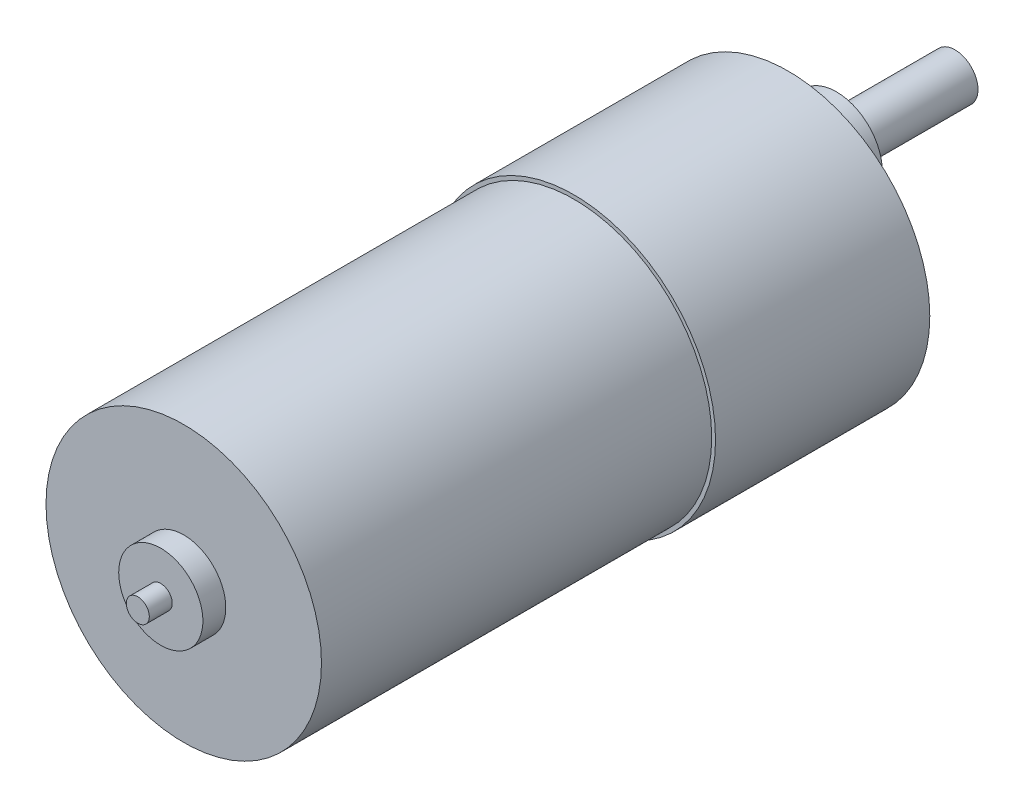
ISO-10303-21;
HEADER;
FILE_DESCRIPTION(('STEP AP214'),'2;1');
FILE_NAME('part.step','',(''),(''),'','','');
FILE_SCHEMA(('AUTOMOTIVE_DESIGN { 1 0 10303 214 1 1 1 1 }'));
ENDSEC;
DATA;
#1=APPLICATION_CONTEXT('core data for automotive mechanical design processes');
#2=APPLICATION_PROTOCOL_DEFINITION('international standard','automotive_design',2000,#1);
#3=PRODUCT_CONTEXT('',#1,'mechanical');
#4=PRODUCT('Part','Part','',(#3));
#5=PRODUCT_RELATED_PRODUCT_CATEGORY('part','',(#4));
#6=PRODUCT_DEFINITION_FORMATION('','',#4);
#7=PRODUCT_DEFINITION_CONTEXT('part definition',#1,'design');
#8=PRODUCT_DEFINITION('design','',#6,#7);
#9=PRODUCT_DEFINITION_SHAPE('','',#8);
#10=(LENGTH_UNIT() NAMED_UNIT(*) SI_UNIT(.MILLI.,.METRE.));
#11=(NAMED_UNIT(*) PLANE_ANGLE_UNIT() SI_UNIT($,.RADIAN.));
#12=(NAMED_UNIT(*) SI_UNIT($,.STERADIAN.) SOLID_ANGLE_UNIT());
#13=UNCERTAINTY_MEASURE_WITH_UNIT(LENGTH_MEASURE(1.E-05),#10,'distance_accuracy_value','');
#14=(GEOMETRIC_REPRESENTATION_CONTEXT(3) GLOBAL_UNCERTAINTY_ASSIGNED_CONTEXT((#13)) GLOBAL_UNIT_ASSIGNED_CONTEXT((#10,
#11,#12)) REPRESENTATION_CONTEXT('',''));
#15=CARTESIAN_POINT('',(0.,0.,0.));
#16=DIRECTION('',(0.,0.,1.));
#17=DIRECTION('',(1.,0.,0.));
#18=AXIS2_PLACEMENT_3D('',#15,#16,#17);
#19=CARTESIAN_POINT('',(0.,0.,0.));
#20=DIRECTION('',(0.,0.,-1.));
#21=DIRECTION('',(-1.,0.,0.));
#22=AXIS2_PLACEMENT_3D('',#19,#20,#21);
#23=PLANE('',#22);
#24=CARTESIAN_POINT('',(0.,0.,0.));
#25=DIRECTION('',(0.,0.,-1.));
#26=DIRECTION('',(-1.,0.,0.));
#27=AXIS2_PLACEMENT_3D('',#24,#25,#26);
#28=CIRCLE('',#27,1.5);
#29=CARTESIAN_POINT('',(-1.5,0.,0.));
#30=VERTEX_POINT('',#29);
#31=EDGE_CURVE('E148',#30,#30,#28,.T.);
#32=ORIENTED_EDGE('',*,*,#31,.F.);
#33=EDGE_LOOP('',(#32));
#34=FACE_BOUND('',#33,.T.);
#35=ADVANCED_FACE('F39',(#34),#23,.F.);
#36=CARTESIAN_POINT('',(0.,0.,-33.8709677419355));
#37=DIRECTION('',(0.,0.,-1.));
#38=DIRECTION('',(-1.,0.,0.));
#39=AXIS2_PLACEMENT_3D('',#36,#37,#38);
#40=CYLINDRICAL_SURFACE('',#39,1.5);
#41=CARTESIAN_POINT('',(0.,0.,-3.00000000000001));
#42=DIRECTION('',(0.,0.,-1.));
#43=DIRECTION('',(-1.,0.,0.));
#44=AXIS2_PLACEMENT_3D('',#41,#42,#43);
#45=CIRCLE('',#44,1.5);
#46=CARTESIAN_POINT('',(-1.5,0.,-3.00000000000001));
#47=VERTEX_POINT('',#46);
#48=EDGE_CURVE('E146',#47,#47,#45,.T.);
#49=ORIENTED_EDGE('',*,*,#48,.F.);
#50=EDGE_LOOP('',(#49));
#51=FACE_BOUND('',#50,.T.);
#52=ORIENTED_EDGE('',*,*,#31,.T.);
#53=EDGE_LOOP('',(#52));
#54=FACE_BOUND('',#53,.T.);
#55=ADVANCED_FACE('F198',(#51,#54),#40,.T.);
#56=CARTESIAN_POINT('',(0.,-1.5,-3.00000000000001));
#57=DIRECTION('',(0.,0.,-1.));
#58=DIRECTION('',(-1.,0.,0.));
#59=AXIS2_PLACEMENT_3D('',#56,#57,#58);
#60=PLANE('',#59);
#61=CARTESIAN_POINT('',(0.,0.,-3.00000000000001));
#62=DIRECTION('',(0.,0.,-1.));
#63=DIRECTION('',(-1.,0.,0.));
#64=AXIS2_PLACEMENT_3D('',#61,#62,#63);
#65=CIRCLE('',#64,5.50000000000001);
#66=CARTESIAN_POINT('',(-5.50000000000001,0.,-3.00000000000001));
#67=VERTEX_POINT('',#66);
#68=EDGE_CURVE('E143',#67,#67,#65,.T.);
#69=ORIENTED_EDGE('',*,*,#68,.F.);
#70=EDGE_LOOP('',(#69));
#71=FACE_BOUND('',#70,.T.);
#72=ORIENTED_EDGE('',*,*,#48,.T.);
#73=EDGE_LOOP('',(#72));
#74=FACE_BOUND('',#73,.T.);
#75=ADVANCED_FACE('F192',(#71,#74),#60,.F.);
#76=CARTESIAN_POINT('',(0.,0.,-33.8709677419355));
#77=DIRECTION('',(0.,0.,-1.));
#78=DIRECTION('',(-1.,0.,0.));
#79=AXIS2_PLACEMENT_3D('',#76,#77,#78);
#80=CYLINDRICAL_SURFACE('',#79,5.50000000000001);
#81=CARTESIAN_POINT('',(0.,0.,-6.00000000000001));
#82=DIRECTION('',(0.,0.,-1.));
#83=DIRECTION('',(-1.,0.,0.));
#84=AXIS2_PLACEMENT_3D('',#81,#82,#83);
#85=CIRCLE('',#84,5.50000000000001);
#86=CARTESIAN_POINT('',(-5.50000000000001,0.,-6.00000000000001));
#87=VERTEX_POINT('',#86);
#88=EDGE_CURVE('E140',#87,#87,#85,.T.);
#89=ORIENTED_EDGE('',*,*,#88,.F.);
#90=EDGE_LOOP('',(#89));
#91=FACE_BOUND('',#90,.T.);
#92=ORIENTED_EDGE('',*,*,#68,.T.);
#93=EDGE_LOOP('',(#92));
#94=FACE_BOUND('',#93,.T.);
#95=ADVANCED_FACE('F186',(#91,#94),#80,.T.);
#96=CARTESIAN_POINT('',(0.,-5.50000000000001,-6.00000000000001));
#97=DIRECTION('',(0.,0.,-1.));
#98=DIRECTION('',(-1.,0.,0.));
#99=AXIS2_PLACEMENT_3D('',#96,#97,#98);
#100=PLANE('',#99);
#101=CARTESIAN_POINT('',(0.,0.,-6.00000000000001));
#102=DIRECTION('',(0.,0.,-1.));
#103=DIRECTION('',(-1.,0.,0.));
#104=AXIS2_PLACEMENT_3D('',#101,#102,#103);
#105=CIRCLE('',#104,18.);
#106=CARTESIAN_POINT('',(-18.,0.,-6.00000000000001));
#107=VERTEX_POINT('',#106);
#108=EDGE_CURVE('E137',#107,#107,#105,.T.);
#109=ORIENTED_EDGE('',*,*,#108,.F.);
#110=EDGE_LOOP('',(#109));
#111=FACE_BOUND('',#110,.T.);
#112=ORIENTED_EDGE('',*,*,#88,.T.);
#113=EDGE_LOOP('',(#112));
#114=FACE_BOUND('',#113,.T.);
#115=ADVANCED_FACE('F180',(#111,#114),#100,.F.);
#116=CARTESIAN_POINT('',(0.,0.,-33.8709677419355));
#117=DIRECTION('',(0.,0.,-1.));
#118=DIRECTION('',(-1.,0.,0.));
#119=AXIS2_PLACEMENT_3D('',#116,#117,#118);
#120=CYLINDRICAL_SURFACE('',#119,18.);
#121=CARTESIAN_POINT('',(0.,0.,-57.));
#122=DIRECTION('',(0.,0.,-1.));
#123=DIRECTION('',(-1.,0.,0.));
#124=AXIS2_PLACEMENT_3D('',#121,#122,#123);
#125=CIRCLE('',#124,18.);
#126=CARTESIAN_POINT('',(-18.,0.,-57.));
#127=VERTEX_POINT('',#126);
#128=EDGE_CURVE('E133',#127,#127,#125,.T.);
#129=ORIENTED_EDGE('',*,*,#128,.F.);
#130=EDGE_LOOP('',(#129));
#131=FACE_BOUND('',#130,.T.);
#132=ORIENTED_EDGE('',*,*,#108,.T.);
#133=EDGE_LOOP('',(#132));
#134=FACE_BOUND('',#133,.T.);
#135=ADVANCED_FACE('F174',(#131,#134),#120,.T.);
#136=CARTESIAN_POINT('',(0.,-18.,-57.));
#137=DIRECTION('',(0.,0.,-1.));
#138=DIRECTION('',(-1.,0.,0.));
#139=AXIS2_PLACEMENT_3D('',#136,#137,#138);
#140=PLANE('',#139);
#141=CARTESIAN_POINT('',(0.,0.,-57.));
#142=DIRECTION('',(0.,0.,-1.));
#143=DIRECTION('',(-1.,0.,0.));
#144=AXIS2_PLACEMENT_3D('',#141,#142,#143);
#145=CIRCLE('',#144,18.5);
#146=CARTESIAN_POINT('',(-18.5,0.,-57.));
#147=VERTEX_POINT('',#146);
#148=EDGE_CURVE('E129',#147,#147,#145,.T.);
#149=ORIENTED_EDGE('',*,*,#148,.F.);
#150=EDGE_LOOP('',(#149));
#151=FACE_BOUND('',#150,.T.);
#152=ORIENTED_EDGE('',*,*,#128,.T.);
#153=EDGE_LOOP('',(#152));
#154=FACE_BOUND('',#153,.T.);
#155=ADVANCED_FACE('F168',(#151,#154),#140,.F.);
#156=CARTESIAN_POINT('',(0.,0.,-33.8709677419355));
#157=DIRECTION('',(0.,0.,-1.));
#158=DIRECTION('',(-1.,0.,0.));
#159=AXIS2_PLACEMENT_3D('',#156,#157,#158);
#160=CYLINDRICAL_SURFACE('',#159,18.5);
#161=CARTESIAN_POINT('',(0.,0.,-85.));
#162=DIRECTION('',(0.,0.,-1.));
#163=DIRECTION('',(-1.,0.,0.));
#164=AXIS2_PLACEMENT_3D('',#161,#162,#163);
#165=CIRCLE('',#164,18.5);
#166=CARTESIAN_POINT('',(-18.5,0.,-85.));
#167=VERTEX_POINT('',#166);
#168=EDGE_CURVE('E126',#167,#167,#165,.T.);
#169=ORIENTED_EDGE('',*,*,#168,.F.);
#170=EDGE_LOOP('',(#169));
#171=FACE_BOUND('',#170,.T.);
#172=ORIENTED_EDGE('',*,*,#148,.T.);
#173=EDGE_LOOP('',(#172));
#174=FACE_BOUND('',#173,.T.);
#175=ADVANCED_FACE('F161',(#171,#174),#160,.T.);
#176=CARTESIAN_POINT('',(0.,-18.5,-85.));
#177=DIRECTION('',(0.,0.,1.));
#178=DIRECTION('',(1.,0.,0.));
#179=AXIS2_PLACEMENT_3D('',#176,#177,#178);
#180=PLANE('',#179);
#181=CARTESIAN_POINT('',(-7.74999999999997,-13.4233937586588,-85.));
#182=DIRECTION('',(0.,0.,-1.));
#183=DIRECTION('',(-1.,0.,0.));
#184=AXIS2_PLACEMENT_3D('',#181,#182,#183);
#185=CIRCLE('',#184,1.25);
#186=CARTESIAN_POINT('',(-8.99999999999997,-13.4233937586588,-85.));
#187=VERTEX_POINT('',#186);
#188=EDGE_CURVE('E94',#187,#187,#185,.T.);
#189=ORIENTED_EDGE('',*,*,#188,.F.);
#190=EDGE_LOOP('',(#189));
#191=FACE_BOUND('',#190,.T.);
#192=CARTESIAN_POINT('',(-15.5,0.,-85.));
#193=DIRECTION('',(0.,0.,-1.));
#194=DIRECTION('',(-1.,0.,0.));
#195=AXIS2_PLACEMENT_3D('',#192,#193,#194);
#196=CIRCLE('',#195,1.25);
#197=CARTESIAN_POINT('',(-16.75,0.,-85.));
#198=VERTEX_POINT('',#197);
#199=EDGE_CURVE('E103',#198,#198,#196,.T.);
#200=ORIENTED_EDGE('',*,*,#199,.F.);
#201=EDGE_LOOP('',(#200));
#202=FACE_BOUND('',#201,.T.);
#203=CARTESIAN_POINT('',(15.5,0.,-85.));
#204=DIRECTION('',(0.,0.,-1.));
#205=DIRECTION('',(-1.,0.,0.));
#206=AXIS2_PLACEMENT_3D('',#203,#204,#205);
#207=CIRCLE('',#206,1.25);
#208=CARTESIAN_POINT('',(14.25,0.,-85.));
#209=VERTEX_POINT('',#208);
#210=EDGE_CURVE('E109',#209,#209,#207,.T.);
#211=ORIENTED_EDGE('',*,*,#210,.F.);
#212=EDGE_LOOP('',(#211));
#213=FACE_BOUND('',#212,.T.);
#214=CARTESIAN_POINT('',(-7.75000000000006,13.4233937586588,-85.));
#215=DIRECTION('',(0.,0.,-1.));
#216=DIRECTION('',(-1.,0.,0.));
#217=AXIS2_PLACEMENT_3D('',#214,#215,#216);
#218=CIRCLE('',#217,1.25);
#219=CARTESIAN_POINT('',(-9.00000000000006,13.4233937586588,-85.));
#220=VERTEX_POINT('',#219);
#221=EDGE_CURVE('E115',#220,#220,#218,.T.);
#222=ORIENTED_EDGE('',*,*,#221,.F.);
#223=EDGE_LOOP('',(#222));
#224=FACE_BOUND('',#223,.T.);
#225=CARTESIAN_POINT('',(0.,7.,-85.));
#226=DIRECTION('',(0.,0.,1.));
#227=DIRECTION('',(1.,0.,0.));
#228=AXIS2_PLACEMENT_3D('',#225,#226,#227);
#229=CIRCLE('',#228,6.);
#230=CARTESIAN_POINT('',(6.,7.,-85.));
#231=VERTEX_POINT('',#230);
#232=EDGE_CURVE('E42',#231,#231,#229,.F.);
#233=ORIENTED_EDGE('',*,*,#232,.F.);
#234=EDGE_LOOP('',(#233));
#235=FACE_BOUND('',#234,.T.);
#236=ORIENTED_EDGE('',*,*,#168,.T.);
#237=EDGE_LOOP('',(#236));
#238=FACE_BOUND('',#237,.T.);
#239=ADVANCED_FACE('F158',(#191,#202,#213,#224,#235,#238),#180,.F.);
#240=CARTESIAN_POINT('',(0.,7.,-91.3));
#241=DIRECTION('',(0.,0.,1.));
#242=DIRECTION('',(1.,0.,0.));
#243=AXIS2_PLACEMENT_3D('',#240,#241,#242);
#244=CYLINDRICAL_SURFACE('',#243,6.);
#245=CARTESIAN_POINT('',(0.,7.,-91.3));
#246=DIRECTION('',(0.,0.,-1.));
#247=DIRECTION('',(-1.,0.,0.));
#248=AXIS2_PLACEMENT_3D('',#245,#246,#247);
#249=CIRCLE('',#248,6.);
#250=CARTESIAN_POINT('',(-6.,7.,-91.3));
#251=VERTEX_POINT('',#250);
#252=EDGE_CURVE('E121',#251,#251,#249,.T.);
#253=ORIENTED_EDGE('',*,*,#252,.F.);
#254=EDGE_LOOP('',(#253));
#255=FACE_BOUND('',#254,.T.);
#256=ORIENTED_EDGE('',*,*,#232,.T.);
#257=EDGE_LOOP('',(#256));
#258=FACE_BOUND('',#257,.T.);
#259=ADVANCED_FACE('F156',(#255,#258),#244,.T.);
#260=CARTESIAN_POINT('',(0.,7.,-91.3));
#261=DIRECTION('',(0.,0.,-1.));
#262=DIRECTION('',(-1.,0.,0.));
#263=AXIS2_PLACEMENT_3D('',#260,#261,#262);
#264=PLANE('',#263);
#265=CARTESIAN_POINT('',(0.,7.,-91.3));
#266=DIRECTION('',(0.,0.,-1.));
#267=DIRECTION('',(-1.,0.,0.));
#268=AXIS2_PLACEMENT_3D('',#265,#266,#267);
#269=CIRCLE('',#268,3.);
#270=CARTESIAN_POINT('',(-3.,7.,-91.3));
#271=VERTEX_POINT('',#270);
#272=EDGE_CURVE('E11',#271,#271,#269,.T.);
#273=ORIENTED_EDGE('',*,*,#272,.F.);
#274=EDGE_LOOP('',(#273));
#275=FACE_BOUND('',#274,.T.);
#276=ORIENTED_EDGE('',*,*,#252,.T.);
#277=EDGE_LOOP('',(#276));
#278=FACE_BOUND('',#277,.T.);
#279=ADVANCED_FACE('F210',(#275,#278),#264,.T.);
#280=CARTESIAN_POINT('',(0.,7.,-106.8));
#281=DIRECTION('',(0.,0.,1.));
#282=DIRECTION('',(1.,0.,0.));
#283=AXIS2_PLACEMENT_3D('',#280,#281,#282);
#284=CYLINDRICAL_SURFACE('',#283,3.);
#285=CARTESIAN_POINT('',(0.,7.,-106.8));
#286=DIRECTION('',(0.,0.,-1.));
#287=DIRECTION('',(-1.,0.,0.));
#288=AXIS2_PLACEMENT_3D('',#285,#286,#287);
#289=CIRCLE('',#288,3.);
#290=CARTESIAN_POINT('',(-1.6583123951777,4.5,-106.8));
#291=VERTEX_POINT('',#290);
#292=CARTESIAN_POINT('',(1.6583123951777,4.5,-106.8));
#293=VERTEX_POINT('',#292);
#294=EDGE_CURVE('E92',#291,#293,#289,.T.);
#295=ORIENTED_EDGE('',*,*,#294,.F.);
#296=DIRECTION('',(0.,0.,-1.));
#297=VECTOR('',#296,1.);
#298=CARTESIAN_POINT('',(-1.6583123951777,4.5,-94.8));
#299=LINE('',#298,#297);
#300=CARTESIAN_POINT('',(-1.6583123951777,4.5,-94.8));
#301=VERTEX_POINT('',#300);
#302=EDGE_CURVE('E54',#301,#291,#299,.T.);
#303=ORIENTED_EDGE('',*,*,#302,.F.);
#304=CARTESIAN_POINT('',(0.,7.,-94.8));
#305=DIRECTION('',(0.,0.,-1.));
#306=DIRECTION('',(-1.,0.,0.));
#307=AXIS2_PLACEMENT_3D('',#304,#305,#306);
#308=CIRCLE('',#307,3.);
#309=CARTESIAN_POINT('',(1.6583123951777,4.5,-94.8));
#310=VERTEX_POINT('',#309);
#311=EDGE_CURVE('E78',#310,#301,#308,.T.);
#312=ORIENTED_EDGE('',*,*,#311,.F.);
#313=DIRECTION('',(0.,0.,-1.));
#314=VECTOR('',#313,1.);
#315=CARTESIAN_POINT('',(1.6583123951777,4.5,-94.8));
#316=LINE('',#315,#314);
#317=EDGE_CURVE('E86',#310,#293,#316,.T.);
#318=ORIENTED_EDGE('',*,*,#317,.T.);
#319=EDGE_LOOP('',(#295,#303,#312,#318));
#320=FACE_BOUND('',#319,.T.);
#321=ORIENTED_EDGE('',*,*,#272,.T.);
#322=EDGE_LOOP('',(#321));
#323=FACE_BOUND('',#322,.T.);
#324=ADVANCED_FACE('F89',(#320,#323),#284,.T.);
#325=CARTESIAN_POINT('',(0.,7.,-106.8));
#326=DIRECTION('',(0.,0.,-1.));
#327=DIRECTION('',(-1.,0.,0.));
#328=AXIS2_PLACEMENT_3D('',#325,#326,#327);
#329=PLANE('',#328);
#330=DIRECTION('',(1.,0.,0.));
#331=VECTOR('',#330,1.);
#332=CARTESIAN_POINT('',(1.6583123951777,4.5,-106.8));
#333=LINE('',#332,#331);
#334=EDGE_CURVE('E83',#291,#293,#333,.T.);
#335=ORIENTED_EDGE('',*,*,#334,.F.);
#336=ORIENTED_EDGE('',*,*,#294,.T.);
#337=EDGE_LOOP('',(#335,#336));
#338=FACE_BOUND('',#337,.T.);
#339=ADVANCED_FACE('F217',(#338),#329,.T.);
#340=CARTESIAN_POINT('',(-7.75000000000006,13.4233937586588,-81.5));
#341=DIRECTION('',(0.,0.,-1.));
#342=DIRECTION('',(-1.,0.,0.));
#343=AXIS2_PLACEMENT_3D('',#340,#341,#342);
#344=CONICAL_SURFACE('',#343,1.25,1.02974425867666);
#345=CARTESIAN_POINT('',(-7.75000000000006,13.4233937586588,-80.7489242262156));
#346=VERTEX_POINT('',#345);
#347=VERTEX_LOOP('',#346);
#348=FACE_BOUND('',#347,.T.);
#349=CARTESIAN_POINT('',(-7.75000000000006,13.4233937586588,-81.5));
#350=DIRECTION('',(0.,0.,-1.));
#351=DIRECTION('',(-1.,0.,0.));
#352=AXIS2_PLACEMENT_3D('',#349,#350,#351);
#353=CIRCLE('',#352,1.25);
#354=CARTESIAN_POINT('',(-9.00000000000006,13.4233937586588,-81.5));
#355=VERTEX_POINT('',#354);
#356=EDGE_CURVE('E118',#355,#355,#353,.T.);
#357=ORIENTED_EDGE('',*,*,#356,.T.);
#358=EDGE_LOOP('',(#357));
#359=FACE_BOUND('',#358,.T.);
#360=ADVANCED_FACE('F220',(#348,#359),#344,.F.);
#361=CARTESIAN_POINT('',(-7.75000000000006,13.4233937586588,-85.));
#362=DIRECTION('',(0.,0.,-1.));
#363=DIRECTION('',(-1.,0.,0.));
#364=AXIS2_PLACEMENT_3D('',#361,#362,#363);
#365=CYLINDRICAL_SURFACE('',#364,1.25);
#366=ORIENTED_EDGE('',*,*,#356,.F.);
#367=EDGE_LOOP('',(#366));
#368=FACE_BOUND('',#367,.T.);
#369=ORIENTED_EDGE('',*,*,#221,.T.);
#370=EDGE_LOOP('',(#369));
#371=FACE_BOUND('',#370,.T.);
#372=ADVANCED_FACE('F224',(#368,#371),#365,.F.);
#373=CARTESIAN_POINT('',(15.5,0.,-81.5));
#374=DIRECTION('',(0.,0.,-1.));
#375=DIRECTION('',(-1.,0.,0.));
#376=AXIS2_PLACEMENT_3D('',#373,#374,#375);
#377=CONICAL_SURFACE('',#376,1.25,1.02974425867666);
#378=CARTESIAN_POINT('',(15.5,0.,-80.7489242262156));
#379=VERTEX_POINT('',#378);
#380=VERTEX_LOOP('',#379);
#381=FACE_BOUND('',#380,.T.);
#382=CARTESIAN_POINT('',(15.5,0.,-81.5));
#383=DIRECTION('',(0.,0.,-1.));
#384=DIRECTION('',(-1.,0.,0.));
#385=AXIS2_PLACEMENT_3D('',#382,#383,#384);
#386=CIRCLE('',#385,1.25);
#387=CARTESIAN_POINT('',(14.25,0.,-81.5));
#388=VERTEX_POINT('',#387);
#389=EDGE_CURVE('E112',#388,#388,#386,.T.);
#390=ORIENTED_EDGE('',*,*,#389,.T.);
#391=EDGE_LOOP('',(#390));
#392=FACE_BOUND('',#391,.T.);
#393=ADVANCED_FACE('F227',(#381,#392),#377,.F.);
#394=CARTESIAN_POINT('',(15.5,0.,-85.));
#395=DIRECTION('',(0.,0.,-1.));
#396=DIRECTION('',(-1.,0.,0.));
#397=AXIS2_PLACEMENT_3D('',#394,#395,#396);
#398=CYLINDRICAL_SURFACE('',#397,1.25);
#399=ORIENTED_EDGE('',*,*,#389,.F.);
#400=EDGE_LOOP('',(#399));
#401=FACE_BOUND('',#400,.T.);
#402=ORIENTED_EDGE('',*,*,#210,.T.);
#403=EDGE_LOOP('',(#402));
#404=FACE_BOUND('',#403,.T.);
#405=ADVANCED_FACE('F231',(#401,#404),#398,.F.);
#406=CARTESIAN_POINT('',(-15.5,0.,-81.5));
#407=DIRECTION('',(0.,0.,-1.));
#408=DIRECTION('',(-1.,0.,0.));
#409=AXIS2_PLACEMENT_3D('',#406,#407,#408);
#410=CONICAL_SURFACE('',#409,1.25,1.02974425867666);
#411=CARTESIAN_POINT('',(-15.5,0.,-80.7489242262156));
#412=VERTEX_POINT('',#411);
#413=VERTEX_LOOP('',#412);
#414=FACE_BOUND('',#413,.T.);
#415=CARTESIAN_POINT('',(-15.5,0.,-81.5));
#416=DIRECTION('',(0.,0.,-1.));
#417=DIRECTION('',(-1.,0.,0.));
#418=AXIS2_PLACEMENT_3D('',#415,#416,#417);
#419=CIRCLE('',#418,1.25);
#420=CARTESIAN_POINT('',(-16.75,0.,-81.5));
#421=VERTEX_POINT('',#420);
#422=EDGE_CURVE('E106',#421,#421,#419,.T.);
#423=ORIENTED_EDGE('',*,*,#422,.T.);
#424=EDGE_LOOP('',(#423));
#425=FACE_BOUND('',#424,.T.);
#426=ADVANCED_FACE('F235',(#414,#425),#410,.F.);
#427=CARTESIAN_POINT('',(-15.5,0.,-85.));
#428=DIRECTION('',(0.,0.,-1.));
#429=DIRECTION('',(-1.,0.,0.));
#430=AXIS2_PLACEMENT_3D('',#427,#428,#429);
#431=CYLINDRICAL_SURFACE('',#430,1.25);
#432=ORIENTED_EDGE('',*,*,#422,.F.);
#433=EDGE_LOOP('',(#432));
#434=FACE_BOUND('',#433,.T.);
#435=ORIENTED_EDGE('',*,*,#199,.T.);
#436=EDGE_LOOP('',(#435));
#437=FACE_BOUND('',#436,.T.);
#438=ADVANCED_FACE('F239',(#434,#437),#431,.F.);
#439=CARTESIAN_POINT('',(-7.74999999999997,-13.4233937586588,-81.5));
#440=DIRECTION('',(0.,0.,-1.));
#441=DIRECTION('',(-1.,0.,0.));
#442=AXIS2_PLACEMENT_3D('',#439,#440,#441);
#443=CONICAL_SURFACE('',#442,1.25,1.02974425867666);
#444=CARTESIAN_POINT('',(-7.74999999999997,-13.4233937586588,-80.7489242262156));
#445=VERTEX_POINT('',#444);
#446=VERTEX_LOOP('',#445);
#447=FACE_BOUND('',#446,.T.);
#448=CARTESIAN_POINT('',(-7.74999999999997,-13.4233937586588,-81.5));
#449=DIRECTION('',(0.,0.,-1.));
#450=DIRECTION('',(-1.,0.,0.));
#451=AXIS2_PLACEMENT_3D('',#448,#449,#450);
#452=CIRCLE('',#451,1.25);
#453=CARTESIAN_POINT('',(-8.99999999999997,-13.4233937586588,-81.5));
#454=VERTEX_POINT('',#453);
#455=EDGE_CURVE('E100',#454,#454,#452,.T.);
#456=ORIENTED_EDGE('',*,*,#455,.T.);
#457=EDGE_LOOP('',(#456));
#458=FACE_BOUND('',#457,.T.);
#459=ADVANCED_FACE('F243',(#447,#458),#443,.F.);
#460=CARTESIAN_POINT('',(-7.74999999999997,-13.4233937586588,-85.));
#461=DIRECTION('',(0.,0.,-1.));
#462=DIRECTION('',(-1.,0.,0.));
#463=AXIS2_PLACEMENT_3D('',#460,#461,#462);
#464=CYLINDRICAL_SURFACE('',#463,1.25);
#465=ORIENTED_EDGE('',*,*,#455,.F.);
#466=EDGE_LOOP('',(#465));
#467=FACE_BOUND('',#466,.T.);
#468=ORIENTED_EDGE('',*,*,#188,.T.);
#469=EDGE_LOOP('',(#468));
#470=FACE_BOUND('',#469,.T.);
#471=ADVANCED_FACE('F247',(#467,#470),#464,.F.);
#472=CARTESIAN_POINT('',(1.6583123951777,4.5,-94.8));
#473=DIRECTION('',(0.,1.,0.));
#474=DIRECTION('',(0.,0.,1.));
#475=AXIS2_PLACEMENT_3D('',#472,#473,#474);
#476=PLANE('',#475);
#477=ORIENTED_EDGE('',*,*,#334,.T.);
#478=ORIENTED_EDGE('',*,*,#317,.F.);
#479=DIRECTION('',(1.,0.,0.));
#480=VECTOR('',#479,1.);
#481=CARTESIAN_POINT('',(1.6583123951777,4.5,-94.8));
#482=LINE('',#481,#480);
#483=EDGE_CURVE('E80',#301,#310,#482,.T.);
#484=ORIENTED_EDGE('',*,*,#483,.F.);
#485=ORIENTED_EDGE('',*,*,#302,.T.);
#486=EDGE_LOOP('',(#477,#478,#484,#485));
#487=FACE_BOUND('',#486,.T.);
#488=ADVANCED_FACE('F85',(#487),#476,.F.);
#489=CARTESIAN_POINT('',(0.,7.,-94.8));
#490=DIRECTION('',(0.,0.,-1.));
#491=DIRECTION('',(-1.,0.,0.));
#492=AXIS2_PLACEMENT_3D('',#489,#490,#491);
#493=PLANE('',#492);
#494=ORIENTED_EDGE('',*,*,#311,.T.);
#495=ORIENTED_EDGE('',*,*,#483,.T.);
#496=EDGE_LOOP('',(#494,#495));
#497=FACE_BOUND('',#496,.T.);
#498=ADVANCED_FACE('F79',(#497),#493,.T.);
#499=CLOSED_SHELL('',(#35,#55,#75,#95,#115,#135,#155,#175,#239,#259,#279,#324,#339,#360,#372,
#393,#405,#426,#438,#459,#471,#488,#498));
#500=MANIFOLD_SOLID_BREP('B2',#499);
#501=ADVANCED_BREP_SHAPE_REPRESENTATION('',(#18,#500),#14);
#502=SHAPE_DEFINITION_REPRESENTATION(#9,#501);
ENDSEC;
END-ISO-10303-21;
